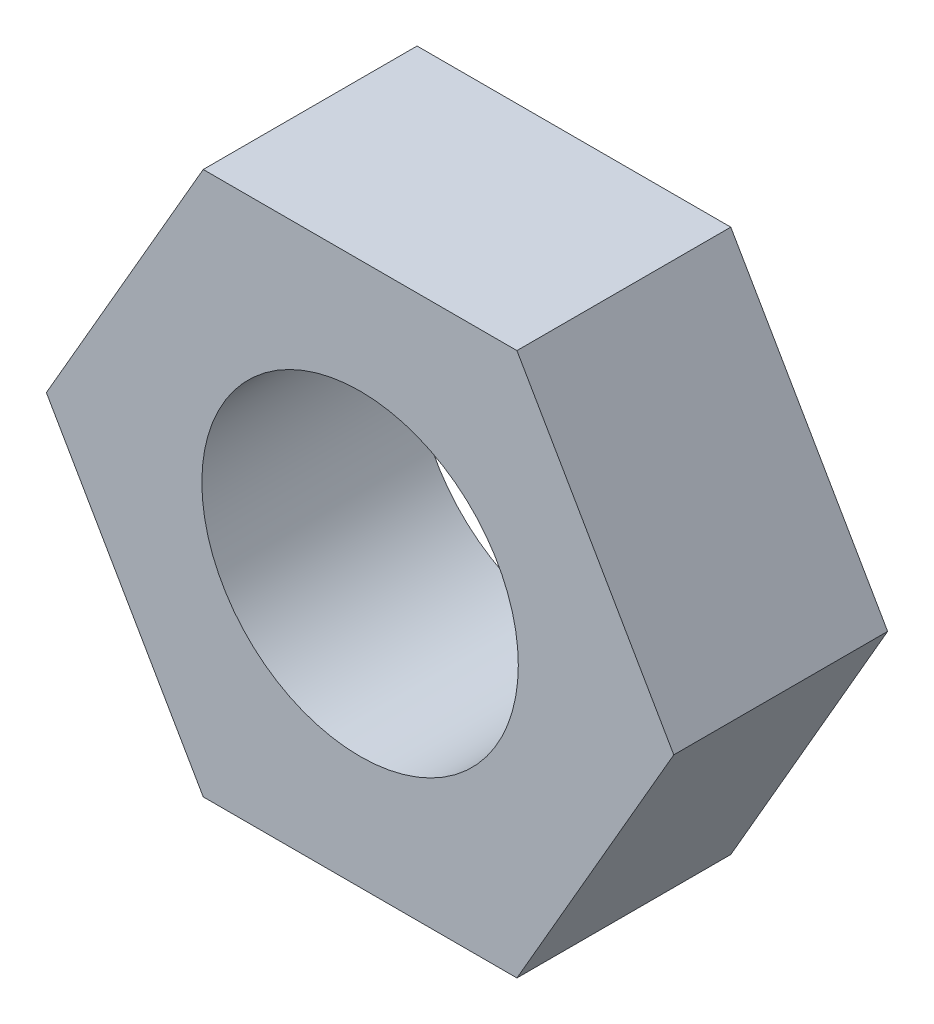
ISO-10303-21;
HEADER;
FILE_DESCRIPTION(('STEP AP214'),'2;1');
FILE_NAME('part.step','',(''),(''),'','','');
FILE_SCHEMA(('AUTOMOTIVE_DESIGN { 1 0 10303 214 1 1 1 1 }'));
ENDSEC;
DATA;
#1=APPLICATION_CONTEXT('core data for automotive mechanical design processes');
#2=APPLICATION_PROTOCOL_DEFINITION('international standard','automotive_design',2000,#1);
#3=PRODUCT_CONTEXT('',#1,'mechanical');
#4=PRODUCT('Part','Part','',(#3));
#5=PRODUCT_RELATED_PRODUCT_CATEGORY('part','',(#4));
#6=PRODUCT_DEFINITION_FORMATION('','',#4);
#7=PRODUCT_DEFINITION_CONTEXT('part definition',#1,'design');
#8=PRODUCT_DEFINITION('design','',#6,#7);
#9=PRODUCT_DEFINITION_SHAPE('','',#8);
#10=(LENGTH_UNIT() NAMED_UNIT(*) SI_UNIT(.MILLI.,.METRE.));
#11=(NAMED_UNIT(*) PLANE_ANGLE_UNIT() SI_UNIT($,.RADIAN.));
#12=(NAMED_UNIT(*) SI_UNIT($,.STERADIAN.) SOLID_ANGLE_UNIT());
#13=UNCERTAINTY_MEASURE_WITH_UNIT(LENGTH_MEASURE(1.E-05),#10,'distance_accuracy_value','');
#14=(GEOMETRIC_REPRESENTATION_CONTEXT(3) GLOBAL_UNCERTAINTY_ASSIGNED_CONTEXT((#13)) GLOBAL_UNIT_ASSIGNED_CONTEXT((#10,
#11,#12)) REPRESENTATION_CONTEXT('',''));
#15=CARTESIAN_POINT('',(0.,0.,0.));
#16=DIRECTION('',(0.,0.,1.));
#17=DIRECTION('',(1.,0.,0.));
#18=AXIS2_PLACEMENT_3D('',#15,#16,#17);
#19=CARTESIAN_POINT('',(0.,0.,3.175));
#20=DIRECTION('',(0.,0.,1.));
#21=DIRECTION('',(1.,0.,0.));
#22=AXIS2_PLACEMENT_3D('',#19,#20,#21);
#23=PLANE('',#22);
#24=DIRECTION('',(0.499999999999995,0.866025403784441,0.));
#25=VECTOR('',#24,1.);
#26=CARTESIAN_POINT('',(2.32888995265391,-4.03375572323313,3.175));
#27=LINE('',#26,#25);
#28=CARTESIAN_POINT('',(2.32888995265391,-4.03375572323313,3.175));
#29=VERTEX_POINT('',#28);
#30=CARTESIAN_POINT('',(4.65777990530772,0.,3.175));
#31=VERTEX_POINT('',#30);
#32=EDGE_CURVE('E137',#29,#31,#27,.T.);
#33=ORIENTED_EDGE('',*,*,#32,.T.);
#34=DIRECTION('',(-0.500000000000001,0.866025403784438,0.));
#35=VECTOR('',#34,1.);
#36=CARTESIAN_POINT('',(4.65777990530772,0.,3.175));
#37=LINE('',#36,#35);
#38=CARTESIAN_POINT('',(2.32888995265385,4.03375572323317,3.175));
#39=VERTEX_POINT('',#38);
#40=EDGE_CURVE('E95',#31,#39,#37,.T.);
#41=ORIENTED_EDGE('',*,*,#40,.T.);
#42=DIRECTION('',(-1.,0.,0.));
#43=VECTOR('',#42,1.);
#44=CARTESIAN_POINT('',(2.32888995265385,4.03375572323317,3.175));
#45=LINE('',#44,#43);
#46=CARTESIAN_POINT('',(-2.32888995265388,4.03375572323315,3.175));
#47=VERTEX_POINT('',#46);
#48=EDGE_CURVE('E108',#39,#47,#45,.T.);
#49=ORIENTED_EDGE('',*,*,#48,.T.);
#50=DIRECTION('',(-0.499999999999995,-0.866025403784442,0.));
#51=VECTOR('',#50,1.);
#52=CARTESIAN_POINT('',(-2.32888995265388,4.03375572323315,3.175));
#53=LINE('',#52,#51);
#54=CARTESIAN_POINT('',(-4.65777990530772,0.,3.175));
#55=VERTEX_POINT('',#54);
#56=EDGE_CURVE('E102',#47,#55,#53,.T.);
#57=ORIENTED_EDGE('',*,*,#56,.T.);
#58=DIRECTION('',(0.500000000000007,-0.866025403784435,0.));
#59=VECTOR('',#58,1.);
#60=CARTESIAN_POINT('',(-4.65777990530772,0.,3.175));
#61=LINE('',#60,#59);
#62=CARTESIAN_POINT('',(-2.32888995265382,-4.03375572323318,3.175));
#63=VERTEX_POINT('',#62);
#64=EDGE_CURVE('E106',#55,#63,#61,.T.);
#65=ORIENTED_EDGE('',*,*,#64,.T.);
#66=DIRECTION('',(1.,0.,0.));
#67=VECTOR('',#66,1.);
#68=CARTESIAN_POINT('',(-2.32888995265382,-4.03375572323318,3.175));
#69=LINE('',#68,#67);
#70=EDGE_CURVE('E58',#63,#29,#69,.T.);
#71=ORIENTED_EDGE('',*,*,#70,.T.);
#72=EDGE_LOOP('',(#33,#41,#49,#57,#65,#71));
#73=FACE_BOUND('',#72,.T.);
#74=CARTESIAN_POINT('',(0.,0.,3.175));
#75=DIRECTION('',(0.,0.,1.));
#76=DIRECTION('',(1.,0.,0.));
#77=AXIS2_PLACEMENT_3D('',#74,#75,#76);
#78=CIRCLE('',#77,2.3495);
#79=CARTESIAN_POINT('',(2.3495,0.,3.175));
#80=VERTEX_POINT('',#79);
#81=EDGE_CURVE('E130',#80,#80,#78,.T.);
#82=ORIENTED_EDGE('',*,*,#81,.F.);
#83=EDGE_LOOP('',(#82));
#84=FACE_BOUND('',#83,.T.);
#85=ADVANCED_FACE('F41',(#73,#84),#23,.T.);
#86=CARTESIAN_POINT('',(0.,0.,0.));
#87=DIRECTION('',(0.,0.,1.));
#88=DIRECTION('',(1.,0.,0.));
#89=AXIS2_PLACEMENT_3D('',#86,#87,#88);
#90=PLANE('',#89);
#91=DIRECTION('',(0.499999999999995,0.866025403784441,0.));
#92=VECTOR('',#91,1.);
#93=CARTESIAN_POINT('',(2.32888995265391,-4.03375572323313,0.));
#94=LINE('',#93,#92);
#95=CARTESIAN_POINT('',(2.32888995265391,-4.03375572323313,0.));
#96=VERTEX_POINT('',#95);
#97=CARTESIAN_POINT('',(4.65777990530772,0.,0.));
#98=VERTEX_POINT('',#97);
#99=EDGE_CURVE('E126',#96,#98,#94,.T.);
#100=ORIENTED_EDGE('',*,*,#99,.F.);
#101=DIRECTION('',(1.,0.,0.));
#102=VECTOR('',#101,1.);
#103=CARTESIAN_POINT('',(-2.32888995265382,-4.03375572323318,0.));
#104=LINE('',#103,#102);
#105=CARTESIAN_POINT('',(-2.32888995265382,-4.03375572323318,0.));
#106=VERTEX_POINT('',#105);
#107=EDGE_CURVE('E87',#106,#96,#104,.T.);
#108=ORIENTED_EDGE('',*,*,#107,.F.);
#109=DIRECTION('',(0.500000000000007,-0.866025403784435,0.));
#110=VECTOR('',#109,1.);
#111=CARTESIAN_POINT('',(-4.65777990530772,0.,0.));
#112=LINE('',#111,#110);
#113=CARTESIAN_POINT('',(-4.65777990530772,0.,0.));
#114=VERTEX_POINT('',#113);
#115=EDGE_CURVE('E81',#114,#106,#112,.T.);
#116=ORIENTED_EDGE('',*,*,#115,.F.);
#117=DIRECTION('',(-0.499999999999995,-0.866025403784442,0.));
#118=VECTOR('',#117,1.);
#119=CARTESIAN_POINT('',(-2.32888995265388,4.03375572323315,0.));
#120=LINE('',#119,#118);
#121=CARTESIAN_POINT('',(-2.32888995265388,4.03375572323315,0.));
#122=VERTEX_POINT('',#121);
#123=EDGE_CURVE('E116',#122,#114,#120,.T.);
#124=ORIENTED_EDGE('',*,*,#123,.F.);
#125=DIRECTION('',(-1.,0.,0.));
#126=VECTOR('',#125,1.);
#127=CARTESIAN_POINT('',(2.32888995265385,4.03375572323317,0.));
#128=LINE('',#127,#126);
#129=CARTESIAN_POINT('',(2.32888995265385,4.03375572323317,0.));
#130=VERTEX_POINT('',#129);
#131=EDGE_CURVE('E132',#130,#122,#128,.T.);
#132=ORIENTED_EDGE('',*,*,#131,.F.);
#133=DIRECTION('',(-0.500000000000001,0.866025403784438,0.));
#134=VECTOR('',#133,1.);
#135=CARTESIAN_POINT('',(4.65777990530772,0.,0.));
#136=LINE('',#135,#134);
#137=EDGE_CURVE('E129',#98,#130,#136,.T.);
#138=ORIENTED_EDGE('',*,*,#137,.F.);
#139=EDGE_LOOP('',(#100,#108,#116,#124,#132,#138));
#140=FACE_BOUND('',#139,.T.);
#141=CARTESIAN_POINT('',(0.,0.,0.));
#142=DIRECTION('',(0.,0.,1.));
#143=DIRECTION('',(1.,0.,0.));
#144=AXIS2_PLACEMENT_3D('',#141,#142,#143);
#145=CIRCLE('',#144,2.3495);
#146=CARTESIAN_POINT('',(2.3495,0.,0.));
#147=VERTEX_POINT('',#146);
#148=EDGE_CURVE('E230',#147,#147,#145,.T.);
#149=ORIENTED_EDGE('',*,*,#148,.T.);
#150=EDGE_LOOP('',(#149));
#151=FACE_BOUND('',#150,.T.);
#152=ADVANCED_FACE('F146',(#140,#151),#90,.F.);
#153=CARTESIAN_POINT('',(2.32888995265391,-4.03375572323313,3.175));
#154=DIRECTION('',(-0.866025403784441,0.499999999999995,0.));
#155=DIRECTION('',(-0.499999999999995,-0.866025403784441,0.));
#156=AXIS2_PLACEMENT_3D('',#153,#154,#155);
#157=PLANE('',#156);
#158=ORIENTED_EDGE('',*,*,#99,.T.);
#159=DIRECTION('',(0.,0.,-1.));
#160=VECTOR('',#159,1.);
#161=CARTESIAN_POINT('',(4.65777990530772,0.,3.175));
#162=LINE('',#161,#160);
#163=EDGE_CURVE('E11',#31,#98,#162,.T.);
#164=ORIENTED_EDGE('',*,*,#163,.F.);
#165=ORIENTED_EDGE('',*,*,#32,.F.);
#166=DIRECTION('',(0.,0.,-1.));
#167=VECTOR('',#166,1.);
#168=CARTESIAN_POINT('',(2.32888995265391,-4.03375572323313,3.175));
#169=LINE('',#168,#167);
#170=EDGE_CURVE('E122',#29,#96,#169,.T.);
#171=ORIENTED_EDGE('',*,*,#170,.T.);
#172=EDGE_LOOP('',(#158,#164,#165,#171));
#173=FACE_BOUND('',#172,.T.);
#174=ADVANCED_FACE('F43',(#173),#157,.F.);
#175=CARTESIAN_POINT('',(4.65777990530772,0.,3.175));
#176=DIRECTION('',(-0.866025403784438,-0.500000000000001,0.));
#177=DIRECTION('',(0.500000000000001,-0.866025403784438,0.));
#178=AXIS2_PLACEMENT_3D('',#175,#176,#177);
#179=PLANE('',#178);
#180=ORIENTED_EDGE('',*,*,#137,.T.);
#181=DIRECTION('',(0.,0.,-1.));
#182=VECTOR('',#181,1.);
#183=CARTESIAN_POINT('',(2.32888995265385,4.03375572323317,3.175));
#184=LINE('',#183,#182);
#185=EDGE_CURVE('E50',#39,#130,#184,.T.);
#186=ORIENTED_EDGE('',*,*,#185,.F.);
#187=ORIENTED_EDGE('',*,*,#40,.F.);
#188=ORIENTED_EDGE('',*,*,#163,.T.);
#189=EDGE_LOOP('',(#180,#186,#187,#188));
#190=FACE_BOUND('',#189,.T.);
#191=ADVANCED_FACE('F171',(#190),#179,.F.);
#192=CARTESIAN_POINT('',(2.32888995265385,4.03375572323317,3.175));
#193=DIRECTION('',(0.,-1.,0.));
#194=DIRECTION('',(1.,0.,0.));
#195=AXIS2_PLACEMENT_3D('',#192,#193,#194);
#196=PLANE('',#195);
#197=ORIENTED_EDGE('',*,*,#131,.T.);
#198=DIRECTION('',(0.,0.,-1.));
#199=VECTOR('',#198,1.);
#200=CARTESIAN_POINT('',(-2.32888995265388,4.03375572323315,3.175));
#201=LINE('',#200,#199);
#202=EDGE_CURVE('E117',#47,#122,#201,.T.);
#203=ORIENTED_EDGE('',*,*,#202,.F.);
#204=ORIENTED_EDGE('',*,*,#48,.F.);
#205=ORIENTED_EDGE('',*,*,#185,.T.);
#206=EDGE_LOOP('',(#197,#203,#204,#205));
#207=FACE_BOUND('',#206,.T.);
#208=ADVANCED_FACE('F143',(#207),#196,.F.);
#209=CARTESIAN_POINT('',(-2.32888995265388,4.03375572323315,3.175));
#210=DIRECTION('',(0.866025403784442,-0.499999999999995,0.));
#211=DIRECTION('',(0.499999999999995,0.866025403784442,0.));
#212=AXIS2_PLACEMENT_3D('',#209,#210,#211);
#213=PLANE('',#212);
#214=ORIENTED_EDGE('',*,*,#123,.T.);
#215=DIRECTION('',(0.,0.,-1.));
#216=VECTOR('',#215,1.);
#217=CARTESIAN_POINT('',(-4.65777990530772,0.,3.175));
#218=LINE('',#217,#216);
#219=EDGE_CURVE('E113',#55,#114,#218,.T.);
#220=ORIENTED_EDGE('',*,*,#219,.F.);
#221=ORIENTED_EDGE('',*,*,#56,.F.);
#222=ORIENTED_EDGE('',*,*,#202,.T.);
#223=EDGE_LOOP('',(#214,#220,#221,#222));
#224=FACE_BOUND('',#223,.T.);
#225=ADVANCED_FACE('F114',(#224),#213,.F.);
#226=CARTESIAN_POINT('',(-4.65777990530772,0.,3.175));
#227=DIRECTION('',(0.866025403784435,0.500000000000007,0.));
#228=DIRECTION('',(-0.500000000000007,0.866025403784435,0.));
#229=AXIS2_PLACEMENT_3D('',#226,#227,#228);
#230=PLANE('',#229);
#231=ORIENTED_EDGE('',*,*,#115,.T.);
#232=DIRECTION('',(0.,0.,-1.));
#233=VECTOR('',#232,1.);
#234=CARTESIAN_POINT('',(-2.32888995265382,-4.03375572323318,3.175));
#235=LINE('',#234,#233);
#236=EDGE_CURVE('E118',#63,#106,#235,.T.);
#237=ORIENTED_EDGE('',*,*,#236,.F.);
#238=ORIENTED_EDGE('',*,*,#64,.F.);
#239=ORIENTED_EDGE('',*,*,#219,.T.);
#240=EDGE_LOOP('',(#231,#237,#238,#239));
#241=FACE_BOUND('',#240,.T.);
#242=ADVANCED_FACE('F120',(#241),#230,.F.);
#243=CARTESIAN_POINT('',(-2.32888995265382,-4.03375572323318,3.175));
#244=DIRECTION('',(0.,1.,0.));
#245=DIRECTION('',(-1.,0.,0.));
#246=AXIS2_PLACEMENT_3D('',#243,#244,#245);
#247=PLANE('',#246);
#248=ORIENTED_EDGE('',*,*,#107,.T.);
#249=ORIENTED_EDGE('',*,*,#170,.F.);
#250=ORIENTED_EDGE('',*,*,#70,.F.);
#251=ORIENTED_EDGE('',*,*,#236,.T.);
#252=EDGE_LOOP('',(#248,#249,#250,#251));
#253=FACE_BOUND('',#252,.T.);
#254=ADVANCED_FACE('F151',(#253),#247,.F.);
#255=CARTESIAN_POINT('',(0.,0.,3.175));
#256=DIRECTION('',(0.,0.,-1.));
#257=DIRECTION('',(-1.,0.,0.));
#258=AXIS2_PLACEMENT_3D('',#255,#256,#257);
#259=CYLINDRICAL_SURFACE('',#258,2.3495);
#260=ORIENTED_EDGE('',*,*,#81,.T.);
#261=EDGE_LOOP('',(#260));
#262=FACE_BOUND('',#261,.T.);
#263=ORIENTED_EDGE('',*,*,#148,.F.);
#264=EDGE_LOOP('',(#263));
#265=FACE_BOUND('',#264,.T.);
#266=ADVANCED_FACE('F153',(#262,#265),#259,.F.);
#267=CLOSED_SHELL('',(#85,#152,#174,#191,#208,#225,#242,#254,#266));
#268=MANIFOLD_SOLID_BREP('B2',#267);
#269=ADVANCED_BREP_SHAPE_REPRESENTATION('',(#18,#268),#14);
#270=SHAPE_DEFINITION_REPRESENTATION(#9,#269);
ENDSEC;
END-ISO-10303-21;
